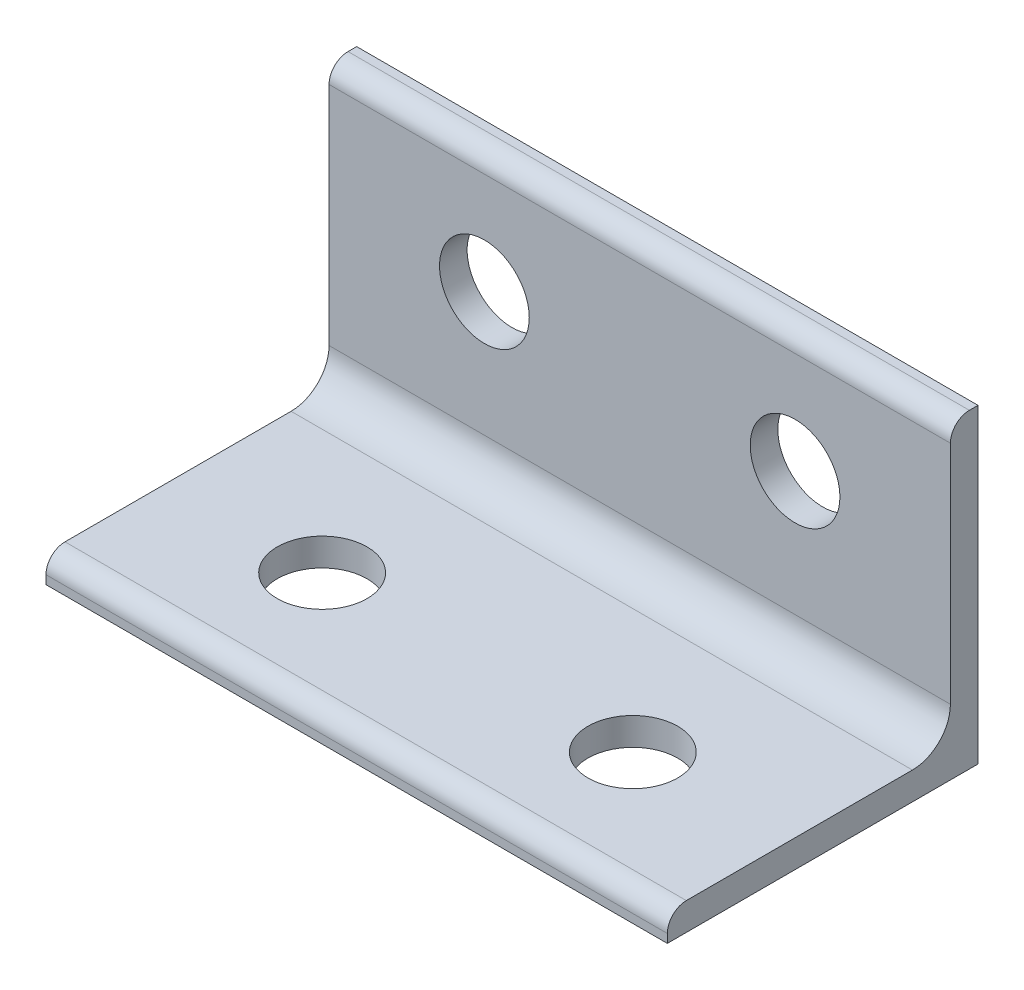
ISO-10303-21;
HEADER;
FILE_DESCRIPTION(('STEP AP214'),'2;1');
FILE_NAME('part.step','',(''),(''),'','','');
FILE_SCHEMA(('AUTOMOTIVE_DESIGN { 1 0 10303 214 1 1 1 1 }'));
ENDSEC;
DATA;
#1=APPLICATION_CONTEXT('core data for automotive mechanical design processes');
#2=APPLICATION_PROTOCOL_DEFINITION('international standard','automotive_design',2000,#1);
#3=PRODUCT_CONTEXT('',#1,'mechanical');
#4=PRODUCT('Part','Part','',(#3));
#5=PRODUCT_RELATED_PRODUCT_CATEGORY('part','',(#4));
#6=PRODUCT_DEFINITION_FORMATION('','',#4);
#7=PRODUCT_DEFINITION_CONTEXT('part definition',#1,'design');
#8=PRODUCT_DEFINITION('design','',#6,#7);
#9=PRODUCT_DEFINITION_SHAPE('','',#8);
#10=(LENGTH_UNIT() NAMED_UNIT(*) SI_UNIT(.MILLI.,.METRE.));
#11=(NAMED_UNIT(*) PLANE_ANGLE_UNIT() SI_UNIT($,.RADIAN.));
#12=(NAMED_UNIT(*) SI_UNIT($,.STERADIAN.) SOLID_ANGLE_UNIT());
#13=UNCERTAINTY_MEASURE_WITH_UNIT(LENGTH_MEASURE(1.E-05),#10,'distance_accuracy_value','');
#14=(GEOMETRIC_REPRESENTATION_CONTEXT(3) GLOBAL_UNCERTAINTY_ASSIGNED_CONTEXT((#13)) GLOBAL_UNIT_ASSIGNED_CONTEXT((#10,
#11,#12)) REPRESENTATION_CONTEXT('',''));
#15=CARTESIAN_POINT('',(0.,0.,0.));
#16=DIRECTION('',(0.,0.,1.));
#17=DIRECTION('',(1.,0.,0.));
#18=AXIS2_PLACEMENT_3D('',#15,#16,#17);
#19=CARTESIAN_POINT('',(180.,0.,0.));
#20=DIRECTION('',(0.,0.,1.));
#21=DIRECTION('',(1.,0.,0.));
#22=AXIS2_PLACEMENT_3D('',#19,#20,#21);
#23=PLANE('',#22);
#24=CARTESIAN_POINT('',(135.,55.,0.));
#25=DIRECTION('',(0.,0.,1.));
#26=DIRECTION('',(1.,0.,0.));
#27=AXIS2_PLACEMENT_3D('',#24,#25,#26);
#28=CIRCLE('',#27,13.);
#29=CARTESIAN_POINT('',(148.,55.,0.));
#30=VERTEX_POINT('',#29);
#31=EDGE_CURVE('E273',#30,#30,#28,.F.);
#32=ORIENTED_EDGE('',*,*,#31,.F.);
#33=EDGE_LOOP('',(#32));
#34=FACE_BOUND('',#33,.T.);
#35=CARTESIAN_POINT('',(45.,55.,0.));
#36=DIRECTION('',(0.,0.,1.));
#37=DIRECTION('',(1.,0.,0.));
#38=AXIS2_PLACEMENT_3D('',#35,#36,#37);
#39=CIRCLE('',#38,13.);
#40=CARTESIAN_POINT('',(58.,55.,0.));
#41=VERTEX_POINT('',#40);
#42=EDGE_CURVE('E218',#41,#41,#39,.F.);
#43=ORIENTED_EDGE('',*,*,#42,.F.);
#44=EDGE_LOOP('',(#43));
#45=FACE_BOUND('',#44,.T.);
#46=DIRECTION('',(0.,1.,0.));
#47=VECTOR('',#46,1.);
#48=CARTESIAN_POINT('',(0.,0.,0.));
#49=LINE('',#48,#47);
#50=CARTESIAN_POINT('',(0.,0.,0.));
#51=VERTEX_POINT('',#50);
#52=CARTESIAN_POINT('',(0.,90.,0.));
#53=VERTEX_POINT('',#52);
#54=EDGE_CURVE('E175',#51,#53,#49,.T.);
#55=ORIENTED_EDGE('',*,*,#54,.T.);
#56=DIRECTION('',(-1.,0.,0.));
#57=VECTOR('',#56,1.);
#58=CARTESIAN_POINT('',(180.,90.,0.));
#59=LINE('',#58,#57);
#60=CARTESIAN_POINT('',(180.,90.,0.));
#61=VERTEX_POINT('',#60);
#62=EDGE_CURVE('E13',#61,#53,#59,.T.);
#63=ORIENTED_EDGE('',*,*,#62,.F.);
#64=DIRECTION('',(0.,1.,0.));
#65=VECTOR('',#64,1.);
#66=CARTESIAN_POINT('',(180.,0.,0.));
#67=LINE('',#66,#65);
#68=CARTESIAN_POINT('',(180.,0.,0.));
#69=VERTEX_POINT('',#68);
#70=EDGE_CURVE('E192',#69,#61,#67,.T.);
#71=ORIENTED_EDGE('',*,*,#70,.F.);
#72=DIRECTION('',(-1.,0.,0.));
#73=VECTOR('',#72,1.);
#74=CARTESIAN_POINT('',(180.,0.,0.));
#75=LINE('',#74,#73);
#76=EDGE_CURVE('E171',#69,#51,#75,.T.);
#77=ORIENTED_EDGE('',*,*,#76,.T.);
#78=EDGE_LOOP('',(#55,#63,#71,#77));
#79=FACE_BOUND('',#78,.T.);
#80=ADVANCED_FACE('F71',(#34,#45,#79),#23,.F.);
#81=CARTESIAN_POINT('',(180.,90.,0.));
#82=DIRECTION('',(0.,-1.,0.));
#83=DIRECTION('',(0.,0.,-1.));
#84=AXIS2_PLACEMENT_3D('',#81,#82,#83);
#85=PLANE('',#84);
#86=DIRECTION('',(0.,0.,1.));
#87=VECTOR('',#86,1.);
#88=CARTESIAN_POINT('',(0.,90.,0.));
#89=LINE('',#88,#87);
#90=CARTESIAN_POINT('',(0.,90.,2.5));
#91=VERTEX_POINT('',#90);
#92=EDGE_CURVE('E178',#53,#91,#89,.T.);
#93=ORIENTED_EDGE('',*,*,#92,.T.);
#94=DIRECTION('',(-1.,0.,0.));
#95=VECTOR('',#94,1.);
#96=CARTESIAN_POINT('',(180.,90.,2.5));
#97=LINE('',#96,#95);
#98=CARTESIAN_POINT('',(180.,90.,2.5));
#99=VERTEX_POINT('',#98);
#100=EDGE_CURVE('E80',#99,#91,#97,.T.);
#101=ORIENTED_EDGE('',*,*,#100,.F.);
#102=DIRECTION('',(0.,0.,1.));
#103=VECTOR('',#102,1.);
#104=CARTESIAN_POINT('',(180.,90.,0.));
#105=LINE('',#104,#103);
#106=EDGE_CURVE('E135',#61,#99,#105,.T.);
#107=ORIENTED_EDGE('',*,*,#106,.F.);
#108=ORIENTED_EDGE('',*,*,#62,.T.);
#109=EDGE_LOOP('',(#93,#101,#107,#108));
#110=FACE_BOUND('',#109,.T.);
#111=ADVANCED_FACE('F262',(#110),#85,.F.);
#112=CARTESIAN_POINT('',(180.,84.5,2.5));
#113=DIRECTION('',(-1.,0.,0.));
#114=DIRECTION('',(0.,0.,1.));
#115=AXIS2_PLACEMENT_3D('',#112,#113,#114);
#116=CYLINDRICAL_SURFACE('',#115,5.5);
#117=CARTESIAN_POINT('',(0.,84.5,2.5));
#118=DIRECTION('',(1.,0.,0.));
#119=DIRECTION('',(0.,0.,-1.));
#120=AXIS2_PLACEMENT_3D('',#117,#118,#119);
#121=CIRCLE('',#120,5.5);
#122=CARTESIAN_POINT('',(0.,84.5,8.00000000000001));
#123=VERTEX_POINT('',#122);
#124=EDGE_CURVE('E181',#91,#123,#121,.T.);
#125=ORIENTED_EDGE('',*,*,#124,.T.);
#126=DIRECTION('',(-1.,0.,0.));
#127=VECTOR('',#126,1.);
#128=CARTESIAN_POINT('',(180.,84.5,8.00000000000001));
#129=LINE('',#128,#127);
#130=CARTESIAN_POINT('',(180.,84.5,8.00000000000001));
#131=VERTEX_POINT('',#130);
#132=EDGE_CURVE('E202',#131,#123,#129,.T.);
#133=ORIENTED_EDGE('',*,*,#132,.F.);
#134=CARTESIAN_POINT('',(180.,84.5,2.5));
#135=DIRECTION('',(1.,0.,0.));
#136=DIRECTION('',(0.,0.,-1.));
#137=AXIS2_PLACEMENT_3D('',#134,#135,#136);
#138=CIRCLE('',#137,5.5);
#139=EDGE_CURVE('E224',#99,#131,#138,.T.);
#140=ORIENTED_EDGE('',*,*,#139,.F.);
#141=ORIENTED_EDGE('',*,*,#100,.T.);
#142=EDGE_LOOP('',(#125,#133,#140,#141));
#143=FACE_BOUND('',#142,.T.);
#144=ADVANCED_FACE('F269',(#143),#116,.T.);
#145=CARTESIAN_POINT('',(180.,84.5,8.00000000000001));
#146=DIRECTION('',(0.,0.,-1.));
#147=DIRECTION('',(0.,1.,0.));
#148=AXIS2_PLACEMENT_3D('',#145,#146,#147);
#149=PLANE('',#148);
#150=CARTESIAN_POINT('',(135.,55.,7.99999999999997));
#151=DIRECTION('',(0.,0.,1.));
#152=DIRECTION('',(1.,0.,0.));
#153=AXIS2_PLACEMENT_3D('',#150,#151,#152);
#154=CIRCLE('',#153,13.);
#155=CARTESIAN_POINT('',(148.,55.,7.99999999999997));
#156=VERTEX_POINT('',#155);
#157=EDGE_CURVE('E281',#156,#156,#154,.T.);
#158=ORIENTED_EDGE('',*,*,#157,.F.);
#159=EDGE_LOOP('',(#158));
#160=FACE_BOUND('',#159,.T.);
#161=CARTESIAN_POINT('',(45.,55.,7.99999999999997));
#162=DIRECTION('',(0.,0.,1.));
#163=DIRECTION('',(1.,0.,0.));
#164=AXIS2_PLACEMENT_3D('',#161,#162,#163);
#165=CIRCLE('',#164,13.);
#166=CARTESIAN_POINT('',(58.,55.,7.99999999999997));
#167=VERTEX_POINT('',#166);
#168=EDGE_CURVE('E277',#167,#167,#165,.T.);
#169=ORIENTED_EDGE('',*,*,#168,.F.);
#170=EDGE_LOOP('',(#169));
#171=FACE_BOUND('',#170,.T.);
#172=DIRECTION('',(0.,-1.,0.));
#173=VECTOR('',#172,1.);
#174=CARTESIAN_POINT('',(0.,84.5,8.00000000000001));
#175=LINE('',#174,#173);
#176=CARTESIAN_POINT('',(0.,19.,7.99999999999998));
#177=VERTEX_POINT('',#176);
#178=EDGE_CURVE('E183',#123,#177,#175,.T.);
#179=ORIENTED_EDGE('',*,*,#178,.T.);
#180=DIRECTION('',(-1.,0.,0.));
#181=VECTOR('',#180,1.);
#182=CARTESIAN_POINT('',(180.,19.,7.99999999999998));
#183=LINE('',#182,#181);
#184=CARTESIAN_POINT('',(180.,19.,7.99999999999998));
#185=VERTEX_POINT('',#184);
#186=EDGE_CURVE('E199',#185,#177,#183,.T.);
#187=ORIENTED_EDGE('',*,*,#186,.F.);
#188=DIRECTION('',(0.,-1.,0.));
#189=VECTOR('',#188,1.);
#190=CARTESIAN_POINT('',(180.,84.5,8.00000000000001));
#191=LINE('',#190,#189);
#192=EDGE_CURVE('E226',#131,#185,#191,.T.);
#193=ORIENTED_EDGE('',*,*,#192,.F.);
#194=ORIENTED_EDGE('',*,*,#132,.T.);
#195=EDGE_LOOP('',(#179,#187,#193,#194));
#196=FACE_BOUND('',#195,.T.);
#197=ADVANCED_FACE('F290',(#160,#171,#196),#149,.F.);
#198=CARTESIAN_POINT('',(180.,19.,19.));
#199=DIRECTION('',(-1.,0.,0.));
#200=DIRECTION('',(0.,0.,1.));
#201=AXIS2_PLACEMENT_3D('',#198,#199,#200);
#202=CYLINDRICAL_SURFACE('',#201,11.);
#203=CARTESIAN_POINT('',(0.,19.,19.));
#204=DIRECTION('',(-1.,0.,0.));
#205=DIRECTION('',(0.,0.,1.));
#206=AXIS2_PLACEMENT_3D('',#203,#204,#205);
#207=CIRCLE('',#206,11.);
#208=CARTESIAN_POINT('',(0.,7.99999999999999,19.));
#209=VERTEX_POINT('',#208);
#210=EDGE_CURVE('E185',#177,#209,#207,.T.);
#211=ORIENTED_EDGE('',*,*,#210,.T.);
#212=DIRECTION('',(-1.,0.,0.));
#213=VECTOR('',#212,1.);
#214=CARTESIAN_POINT('',(180.,7.99999999999999,19.));
#215=LINE('',#214,#213);
#216=CARTESIAN_POINT('',(180.,7.99999999999999,19.));
#217=VERTEX_POINT('',#216);
#218=EDGE_CURVE('E196',#217,#209,#215,.T.);
#219=ORIENTED_EDGE('',*,*,#218,.F.);
#220=CARTESIAN_POINT('',(180.,19.,19.));
#221=DIRECTION('',(-1.,0.,0.));
#222=DIRECTION('',(0.,0.,1.));
#223=AXIS2_PLACEMENT_3D('',#220,#221,#222);
#224=CIRCLE('',#223,11.);
#225=EDGE_CURVE('E228',#185,#217,#224,.T.);
#226=ORIENTED_EDGE('',*,*,#225,.F.);
#227=ORIENTED_EDGE('',*,*,#186,.T.);
#228=EDGE_LOOP('',(#211,#219,#226,#227));
#229=FACE_BOUND('',#228,.T.);
#230=ADVANCED_FACE('F234',(#229),#202,.F.);
#231=CARTESIAN_POINT('',(180.,7.99999999999999,19.));
#232=DIRECTION('',(0.,-1.,0.));
#233=DIRECTION('',(0.,0.,-1.));
#234=AXIS2_PLACEMENT_3D('',#231,#232,#233);
#235=PLANE('',#234);
#236=CARTESIAN_POINT('',(135.,8.00000000000002,55.));
#237=DIRECTION('',(0.,-1.,0.));
#238=DIRECTION('',(0.,0.,-1.));
#239=AXIS2_PLACEMENT_3D('',#236,#237,#238);
#240=CIRCLE('',#239,13.);
#241=CARTESIAN_POINT('',(135.,8.00000000000002,42.));
#242=VERTEX_POINT('',#241);
#243=EDGE_CURVE('E208',#242,#242,#240,.F.);
#244=ORIENTED_EDGE('',*,*,#243,.F.);
#245=EDGE_LOOP('',(#244));
#246=FACE_BOUND('',#245,.T.);
#247=CARTESIAN_POINT('',(45.,8.00000000000002,55.));
#248=DIRECTION('',(0.,-1.,0.));
#249=DIRECTION('',(0.,0.,-1.));
#250=AXIS2_PLACEMENT_3D('',#247,#248,#249);
#251=CIRCLE('',#250,13.);
#252=CARTESIAN_POINT('',(45.,8.00000000000002,42.));
#253=VERTEX_POINT('',#252);
#254=EDGE_CURVE('E179',#253,#253,#251,.F.);
#255=ORIENTED_EDGE('',*,*,#254,.F.);
#256=EDGE_LOOP('',(#255));
#257=FACE_BOUND('',#256,.T.);
#258=DIRECTION('',(0.,0.,1.));
#259=VECTOR('',#258,1.);
#260=CARTESIAN_POINT('',(0.,7.99999999999999,19.));
#261=LINE('',#260,#259);
#262=CARTESIAN_POINT('',(0.,8.00000000000001,84.5));
#263=VERTEX_POINT('',#262);
#264=EDGE_CURVE('E187',#209,#263,#261,.T.);
#265=ORIENTED_EDGE('',*,*,#264,.T.);
#266=DIRECTION('',(-1.,0.,0.));
#267=VECTOR('',#266,1.);
#268=CARTESIAN_POINT('',(180.,8.00000000000001,84.5));
#269=LINE('',#268,#267);
#270=CARTESIAN_POINT('',(180.,8.00000000000001,84.5));
#271=VERTEX_POINT('',#270);
#272=EDGE_CURVE('E166',#271,#263,#269,.T.);
#273=ORIENTED_EDGE('',*,*,#272,.F.);
#274=DIRECTION('',(0.,0.,1.));
#275=VECTOR('',#274,1.);
#276=CARTESIAN_POINT('',(180.,7.99999999999999,19.));
#277=LINE('',#276,#275);
#278=EDGE_CURVE('E157',#217,#271,#277,.T.);
#279=ORIENTED_EDGE('',*,*,#278,.F.);
#280=ORIENTED_EDGE('',*,*,#218,.T.);
#281=EDGE_LOOP('',(#265,#273,#279,#280));
#282=FACE_BOUND('',#281,.T.);
#283=ADVANCED_FACE('F238',(#246,#257,#282),#235,.F.);
#284=CARTESIAN_POINT('',(180.,2.5,84.5));
#285=DIRECTION('',(-1.,0.,0.));
#286=DIRECTION('',(0.,0.,1.));
#287=AXIS2_PLACEMENT_3D('',#284,#285,#286);
#288=CYLINDRICAL_SURFACE('',#287,5.5);
#289=CARTESIAN_POINT('',(0.,2.5,84.5));
#290=DIRECTION('',(1.,0.,0.));
#291=DIRECTION('',(0.,0.,-1.));
#292=AXIS2_PLACEMENT_3D('',#289,#290,#291);
#293=CIRCLE('',#292,5.5);
#294=CARTESIAN_POINT('',(0.,2.5,90.));
#295=VERTEX_POINT('',#294);
#296=EDGE_CURVE('E165',#263,#295,#293,.T.);
#297=ORIENTED_EDGE('',*,*,#296,.T.);
#298=DIRECTION('',(-1.,0.,0.));
#299=VECTOR('',#298,1.);
#300=CARTESIAN_POINT('',(180.,2.5,90.));
#301=LINE('',#300,#299);
#302=CARTESIAN_POINT('',(180.,2.5,90.));
#303=VERTEX_POINT('',#302);
#304=EDGE_CURVE('E162',#303,#295,#301,.T.);
#305=ORIENTED_EDGE('',*,*,#304,.F.);
#306=CARTESIAN_POINT('',(180.,2.5,84.5));
#307=DIRECTION('',(1.,0.,0.));
#308=DIRECTION('',(0.,0.,-1.));
#309=AXIS2_PLACEMENT_3D('',#306,#307,#308);
#310=CIRCLE('',#309,5.5);
#311=EDGE_CURVE('E151',#271,#303,#310,.T.);
#312=ORIENTED_EDGE('',*,*,#311,.F.);
#313=ORIENTED_EDGE('',*,*,#272,.T.);
#314=EDGE_LOOP('',(#297,#305,#312,#313));
#315=FACE_BOUND('',#314,.T.);
#316=ADVANCED_FACE('F163',(#315),#288,.T.);
#317=CARTESIAN_POINT('',(180.,2.5,90.));
#318=DIRECTION('',(0.,0.,-1.));
#319=DIRECTION('',(0.,1.,0.));
#320=AXIS2_PLACEMENT_3D('',#317,#318,#319);
#321=PLANE('',#320);
#322=DIRECTION('',(0.,-1.,0.));
#323=VECTOR('',#322,1.);
#324=CARTESIAN_POINT('',(0.,2.5,90.));
#325=LINE('',#324,#323);
#326=CARTESIAN_POINT('',(0.,0.,90.));
#327=VERTEX_POINT('',#326);
#328=EDGE_CURVE('E121',#295,#327,#325,.T.);
#329=ORIENTED_EDGE('',*,*,#328,.T.);
#330=DIRECTION('',(-1.,0.,0.));
#331=VECTOR('',#330,1.);
#332=CARTESIAN_POINT('',(180.,0.,90.));
#333=LINE('',#332,#331);
#334=CARTESIAN_POINT('',(180.,0.,90.));
#335=VERTEX_POINT('',#334);
#336=EDGE_CURVE('E167',#335,#327,#333,.T.);
#337=ORIENTED_EDGE('',*,*,#336,.F.);
#338=DIRECTION('',(0.,-1.,0.));
#339=VECTOR('',#338,1.);
#340=CARTESIAN_POINT('',(180.,2.5,90.));
#341=LINE('',#340,#339);
#342=EDGE_CURVE('E155',#303,#335,#341,.T.);
#343=ORIENTED_EDGE('',*,*,#342,.F.);
#344=ORIENTED_EDGE('',*,*,#304,.T.);
#345=EDGE_LOOP('',(#329,#337,#343,#344));
#346=FACE_BOUND('',#345,.T.);
#347=ADVANCED_FACE('F169',(#346),#321,.F.);
#348=CARTESIAN_POINT('',(180.,0.,90.));
#349=DIRECTION('',(0.,1.,0.));
#350=DIRECTION('',(0.,0.,1.));
#351=AXIS2_PLACEMENT_3D('',#348,#349,#350);
#352=PLANE('',#351);
#353=CARTESIAN_POINT('',(135.,0.,55.));
#354=DIRECTION('',(0.,1.,0.));
#355=DIRECTION('',(0.,0.,1.));
#356=AXIS2_PLACEMENT_3D('',#353,#354,#355);
#357=CIRCLE('',#356,13.);
#358=CARTESIAN_POINT('',(135.,0.,42.));
#359=VERTEX_POINT('',#358);
#360=EDGE_CURVE('E74',#359,#359,#357,.F.);
#361=ORIENTED_EDGE('',*,*,#360,.F.);
#362=EDGE_LOOP('',(#361));
#363=FACE_BOUND('',#362,.T.);
#364=CARTESIAN_POINT('',(45.,0.,55.));
#365=DIRECTION('',(0.,1.,0.));
#366=DIRECTION('',(0.,0.,1.));
#367=AXIS2_PLACEMENT_3D('',#364,#365,#366);
#368=CIRCLE('',#367,13.);
#369=CARTESIAN_POINT('',(45.,0.,42.));
#370=VERTEX_POINT('',#369);
#371=EDGE_CURVE('E206',#370,#370,#368,.F.);
#372=ORIENTED_EDGE('',*,*,#371,.F.);
#373=EDGE_LOOP('',(#372));
#374=FACE_BOUND('',#373,.T.);
#375=DIRECTION('',(0.,0.,-1.));
#376=VECTOR('',#375,1.);
#377=CARTESIAN_POINT('',(0.,0.,90.));
#378=LINE('',#377,#376);
#379=EDGE_CURVE('E127',#327,#51,#378,.T.);
#380=ORIENTED_EDGE('',*,*,#379,.T.);
#381=ORIENTED_EDGE('',*,*,#76,.F.);
#382=DIRECTION('',(0.,0.,-1.));
#383=VECTOR('',#382,1.);
#384=CARTESIAN_POINT('',(180.,0.,90.));
#385=LINE('',#384,#383);
#386=EDGE_CURVE('E89',#335,#69,#385,.T.);
#387=ORIENTED_EDGE('',*,*,#386,.F.);
#388=ORIENTED_EDGE('',*,*,#336,.T.);
#389=EDGE_LOOP('',(#380,#381,#387,#388));
#390=FACE_BOUND('',#389,.T.);
#391=ADVANCED_FACE('F246',(#363,#374,#390),#352,.F.);
#392=CARTESIAN_POINT('',(180.,84.5,2.5));
#393=DIRECTION('',(1.,0.,0.));
#394=DIRECTION('',(0.,0.,-1.));
#395=AXIS2_PLACEMENT_3D('',#392,#393,#394);
#396=PLANE('',#395);
#397=ORIENTED_EDGE('',*,*,#70,.T.);
#398=ORIENTED_EDGE('',*,*,#106,.T.);
#399=ORIENTED_EDGE('',*,*,#139,.T.);
#400=ORIENTED_EDGE('',*,*,#192,.T.);
#401=ORIENTED_EDGE('',*,*,#225,.T.);
#402=ORIENTED_EDGE('',*,*,#278,.T.);
#403=ORIENTED_EDGE('',*,*,#311,.T.);
#404=ORIENTED_EDGE('',*,*,#342,.T.);
#405=ORIENTED_EDGE('',*,*,#386,.T.);
#406=EDGE_LOOP('',(#397,#398,#399,#400,#401,#402,#403,#404,#405));
#407=FACE_BOUND('',#406,.T.);
#408=ADVANCED_FACE('F153',(#407),#396,.T.);
#409=CARTESIAN_POINT('',(0.,84.5,2.5));
#410=DIRECTION('',(1.,0.,0.));
#411=DIRECTION('',(0.,0.,-1.));
#412=AXIS2_PLACEMENT_3D('',#409,#410,#411);
#413=PLANE('',#412);
#414=ORIENTED_EDGE('',*,*,#54,.F.);
#415=ORIENTED_EDGE('',*,*,#379,.F.);
#416=ORIENTED_EDGE('',*,*,#328,.F.);
#417=ORIENTED_EDGE('',*,*,#296,.F.);
#418=ORIENTED_EDGE('',*,*,#264,.F.);
#419=ORIENTED_EDGE('',*,*,#210,.F.);
#420=ORIENTED_EDGE('',*,*,#178,.F.);
#421=ORIENTED_EDGE('',*,*,#124,.F.);
#422=ORIENTED_EDGE('',*,*,#92,.F.);
#423=EDGE_LOOP('',(#414,#415,#416,#417,#418,#419,#420,#421,#422));
#424=FACE_BOUND('',#423,.T.);
#425=ADVANCED_FACE('F241',(#424),#413,.F.);
#426=CARTESIAN_POINT('',(45.,90.,55.));
#427=DIRECTION('',(0.,-1.,0.));
#428=DIRECTION('',(0.,0.,-1.));
#429=AXIS2_PLACEMENT_3D('',#426,#427,#428);
#430=CYLINDRICAL_SURFACE('',#429,13.);
#431=CARTESIAN_POINT('',(45.,0.,42.));
#432=CARTESIAN_POINT('',(45.,0.0833333333333472,42.));
#433=CARTESIAN_POINT('',(45.,0.166666666666681,42.));
#434=CARTESIAN_POINT('',(45.,0.333333333333348,42.));
#435=CARTESIAN_POINT('',(45.,0.416666666666681,42.));
#436=CARTESIAN_POINT('',(45.,0.583333333333348,42.));
#437=CARTESIAN_POINT('',(45.,0.666666666666681,42.));
#438=CARTESIAN_POINT('',(45.,0.833333333333348,42.));
#439=CARTESIAN_POINT('',(45.,0.916666666666681,42.));
#440=CARTESIAN_POINT('',(45.,1.08333333333335,42.));
#441=CARTESIAN_POINT('',(45.,1.16666666666668,42.));
#442=CARTESIAN_POINT('',(45.,1.33333333333335,42.));
#443=CARTESIAN_POINT('',(45.,1.41666666666668,42.));
#444=CARTESIAN_POINT('',(45.,1.58333333333335,42.));
#445=CARTESIAN_POINT('',(45.,1.66666666666668,42.));
#446=CARTESIAN_POINT('',(45.,1.83333333333335,42.));
#447=CARTESIAN_POINT('',(45.,1.91666666666668,42.));
#448=CARTESIAN_POINT('',(45.,2.08333333333335,42.));
#449=CARTESIAN_POINT('',(45.,2.16666666666668,42.));
#450=CARTESIAN_POINT('',(45.,2.33333333333335,42.));
#451=CARTESIAN_POINT('',(45.,2.41666666666668,42.));
#452=CARTESIAN_POINT('',(45.,2.58333333333335,42.));
#453=CARTESIAN_POINT('',(45.,2.66666666666668,42.));
#454=CARTESIAN_POINT('',(45.,2.83333333333335,42.));
#455=CARTESIAN_POINT('',(45.,2.91666666666668,42.));
#456=CARTESIAN_POINT('',(45.,3.08333333333335,42.));
#457=CARTESIAN_POINT('',(45.,3.16666666666668,42.));
#458=CARTESIAN_POINT('',(45.,3.33333333333335,42.));
#459=CARTESIAN_POINT('',(45.,3.41666666666668,42.));
#460=CARTESIAN_POINT('',(45.,3.58333333333335,42.));
#461=CARTESIAN_POINT('',(45.,3.66666666666668,42.));
#462=CARTESIAN_POINT('',(45.,3.83333333333335,42.));
#463=CARTESIAN_POINT('',(45.,3.91666666666668,42.));
#464=CARTESIAN_POINT('',(45.,4.08333333333335,42.));
#465=CARTESIAN_POINT('',(45.,4.16666666666668,42.));
#466=CARTESIAN_POINT('',(45.,4.33333333333335,42.));
#467=CARTESIAN_POINT('',(45.,4.41666666666668,42.));
#468=CARTESIAN_POINT('',(45.,4.58333333333335,42.));
#469=CARTESIAN_POINT('',(45.,4.66666666666668,42.));
#470=CARTESIAN_POINT('',(45.,4.83333333333335,42.));
#471=CARTESIAN_POINT('',(45.,4.91666666666668,42.));
#472=CARTESIAN_POINT('',(45.,5.08333333333335,42.));
#473=CARTESIAN_POINT('',(45.,5.16666666666668,42.));
#474=CARTESIAN_POINT('',(45.,5.33333333333335,42.));
#475=CARTESIAN_POINT('',(45.,5.41666666666668,42.));
#476=CARTESIAN_POINT('',(45.,5.58333333333335,42.));
#477=CARTESIAN_POINT('',(45.,5.66666666666669,42.));
#478=CARTESIAN_POINT('',(45.,5.83333333333335,42.));
#479=CARTESIAN_POINT('',(45.,5.91666666666669,42.));
#480=CARTESIAN_POINT('',(45.,6.08333333333335,42.));
#481=CARTESIAN_POINT('',(45.,6.16666666666669,42.));
#482=CARTESIAN_POINT('',(45.,6.33333333333335,42.));
#483=CARTESIAN_POINT('',(45.,6.41666666666669,42.));
#484=CARTESIAN_POINT('',(45.,6.58333333333335,42.));
#485=CARTESIAN_POINT('',(45.,6.66666666666669,42.));
#486=CARTESIAN_POINT('',(45.,6.83333333333335,42.));
#487=CARTESIAN_POINT('',(45.,6.91666666666669,42.));
#488=CARTESIAN_POINT('',(45.,7.08333333333335,42.));
#489=CARTESIAN_POINT('',(45.,7.16666666666669,42.));
#490=CARTESIAN_POINT('',(45.,7.33333333333335,42.));
#491=CARTESIAN_POINT('',(45.,7.41666666666669,42.));
#492=CARTESIAN_POINT('',(45.,7.58333333333335,42.));
#493=CARTESIAN_POINT('',(45.,7.66666666666669,42.));
#494=CARTESIAN_POINT('',(45.,7.83333333333335,42.));
#495=CARTESIAN_POINT('',(45.,7.91666666666669,42.));
#496=CARTESIAN_POINT('',(45.,8.00000000000002,42.));
#497=B_SPLINE_CURVE_WITH_KNOTS('',3,(#431,#432,#433,#434,#435,#436,#437,#438,#439,#440,#441,
#442,#443,#444,#445,#446,#447,#448,#449,#450,#451,#452,#453,#454,#455,#456,#457,#458,#459,#460,
#461,#462,#463,#464,#465,#466,#467,#468,#469,#470,#471,#472,#473,#474,#475,#476,#477,#478,#479,
#480,#481,#482,#483,#484,#485,#486,#487,#488,#489,#490,#491,#492,#493,#494,#495,#496),
.UNSPECIFIED.,.F.,.F.,(4,2,2,2,2,2,2,2,2,2,2,2,2,2,2,2,2,2,2,2,2,2,2,2,2,2,2,2,2,2,2,2,4),(0.,
0.25,0.5,0.750000000000001,1.,1.25,1.5,1.75,2.,2.25,2.5,2.75,3.,3.25,3.5,3.75,4.,4.25,4.5,4.75,
5.,5.25,5.50000000000001,5.75000000000001,6.00000000000001,6.25000000000001,6.50000000000001,
6.75000000000001,7.00000000000001,7.25000000000001,7.50000000000001,7.75000000000001,
8.00000000000001),.UNSPECIFIED.);
#498=EDGE_CURVE('BSEAM330',#370,#253,#497,.T.);
#499=ORIENTED_EDGE('',*,*,#371,.T.);
#500=ORIENTED_EDGE('',*,*,#254,.T.);
#501=ORIENTED_EDGE('',*,*,#498,.T.);
#502=ORIENTED_EDGE('',*,*,#498,.F.);
#503=EDGE_LOOP('',(#499,#501,#500,#502));
#504=FACE_BOUND('',#503,.T.);
#505=ADVANCED_FACE('F330',(#504),#430,.F.);
#506=CARTESIAN_POINT('',(135.,90.,55.));
#507=DIRECTION('',(0.,-1.,0.));
#508=DIRECTION('',(0.,0.,-1.));
#509=AXIS2_PLACEMENT_3D('',#506,#507,#508);
#510=CYLINDRICAL_SURFACE('',#509,13.);
#511=CARTESIAN_POINT('',(135.,0.,42.));
#512=CARTESIAN_POINT('',(135.,0.0833333333333472,42.));
#513=CARTESIAN_POINT('',(135.,0.166666666666681,42.));
#514=CARTESIAN_POINT('',(135.,0.333333333333348,42.));
#515=CARTESIAN_POINT('',(135.,0.416666666666681,42.));
#516=CARTESIAN_POINT('',(135.,0.583333333333348,42.));
#517=CARTESIAN_POINT('',(135.,0.666666666666681,42.));
#518=CARTESIAN_POINT('',(135.,0.833333333333348,42.));
#519=CARTESIAN_POINT('',(135.,0.916666666666681,42.));
#520=CARTESIAN_POINT('',(135.,1.08333333333335,42.));
#521=CARTESIAN_POINT('',(135.,1.16666666666668,42.));
#522=CARTESIAN_POINT('',(135.,1.33333333333335,42.));
#523=CARTESIAN_POINT('',(135.,1.41666666666668,42.));
#524=CARTESIAN_POINT('',(135.,1.58333333333335,42.));
#525=CARTESIAN_POINT('',(135.,1.66666666666668,42.));
#526=CARTESIAN_POINT('',(135.,1.83333333333335,42.));
#527=CARTESIAN_POINT('',(135.,1.91666666666668,42.));
#528=CARTESIAN_POINT('',(135.,2.08333333333335,42.));
#529=CARTESIAN_POINT('',(135.,2.16666666666668,42.));
#530=CARTESIAN_POINT('',(135.,2.33333333333335,42.));
#531=CARTESIAN_POINT('',(135.,2.41666666666668,42.));
#532=CARTESIAN_POINT('',(135.,2.58333333333335,42.));
#533=CARTESIAN_POINT('',(135.,2.66666666666668,42.));
#534=CARTESIAN_POINT('',(135.,2.83333333333335,42.));
#535=CARTESIAN_POINT('',(135.,2.91666666666668,42.));
#536=CARTESIAN_POINT('',(135.,3.08333333333335,42.));
#537=CARTESIAN_POINT('',(135.,3.16666666666668,42.));
#538=CARTESIAN_POINT('',(135.,3.33333333333335,42.));
#539=CARTESIAN_POINT('',(135.,3.41666666666668,42.));
#540=CARTESIAN_POINT('',(135.,3.58333333333335,42.));
#541=CARTESIAN_POINT('',(135.,3.66666666666668,42.));
#542=CARTESIAN_POINT('',(135.,3.83333333333335,42.));
#543=CARTESIAN_POINT('',(135.,3.91666666666668,42.));
#544=CARTESIAN_POINT('',(135.,4.08333333333335,42.));
#545=CARTESIAN_POINT('',(135.,4.16666666666668,42.));
#546=CARTESIAN_POINT('',(135.,4.33333333333335,42.));
#547=CARTESIAN_POINT('',(135.,4.41666666666668,42.));
#548=CARTESIAN_POINT('',(135.,4.58333333333335,42.));
#549=CARTESIAN_POINT('',(135.,4.66666666666668,42.));
#550=CARTESIAN_POINT('',(135.,4.83333333333335,42.));
#551=CARTESIAN_POINT('',(135.,4.91666666666668,42.));
#552=CARTESIAN_POINT('',(135.,5.08333333333335,42.));
#553=CARTESIAN_POINT('',(135.,5.16666666666668,42.));
#554=CARTESIAN_POINT('',(135.,5.33333333333335,42.));
#555=CARTESIAN_POINT('',(135.,5.41666666666668,42.));
#556=CARTESIAN_POINT('',(135.,5.58333333333335,42.));
#557=CARTESIAN_POINT('',(135.,5.66666666666669,42.));
#558=CARTESIAN_POINT('',(135.,5.83333333333335,42.));
#559=CARTESIAN_POINT('',(135.,5.91666666666669,42.));
#560=CARTESIAN_POINT('',(135.,6.08333333333335,42.));
#561=CARTESIAN_POINT('',(135.,6.16666666666669,42.));
#562=CARTESIAN_POINT('',(135.,6.33333333333335,42.));
#563=CARTESIAN_POINT('',(135.,6.41666666666669,42.));
#564=CARTESIAN_POINT('',(135.,6.58333333333335,42.));
#565=CARTESIAN_POINT('',(135.,6.66666666666669,42.));
#566=CARTESIAN_POINT('',(135.,6.83333333333335,42.));
#567=CARTESIAN_POINT('',(135.,6.91666666666669,42.));
#568=CARTESIAN_POINT('',(135.,7.08333333333335,42.));
#569=CARTESIAN_POINT('',(135.,7.16666666666669,42.));
#570=CARTESIAN_POINT('',(135.,7.33333333333335,42.));
#571=CARTESIAN_POINT('',(135.,7.41666666666669,42.));
#572=CARTESIAN_POINT('',(135.,7.58333333333335,42.));
#573=CARTESIAN_POINT('',(135.,7.66666666666669,42.));
#574=CARTESIAN_POINT('',(135.,7.83333333333335,42.));
#575=CARTESIAN_POINT('',(135.,7.91666666666669,42.));
#576=CARTESIAN_POINT('',(135.,8.00000000000002,42.));
#577=B_SPLINE_CURVE_WITH_KNOTS('',3,(#511,#512,#513,#514,#515,#516,#517,#518,#519,#520,#521,
#522,#523,#524,#525,#526,#527,#528,#529,#530,#531,#532,#533,#534,#535,#536,#537,#538,#539,#540,
#541,#542,#543,#544,#545,#546,#547,#548,#549,#550,#551,#552,#553,#554,#555,#556,#557,#558,#559,
#560,#561,#562,#563,#564,#565,#566,#567,#568,#569,#570,#571,#572,#573,#574,#575,#576),
.UNSPECIFIED.,.F.,.F.,(4,2,2,2,2,2,2,2,2,2,2,2,2,2,2,2,2,2,2,2,2,2,2,2,2,2,2,2,2,2,2,2,4),(0.,
0.25,0.5,0.750000000000001,1.,1.25,1.5,1.75,2.,2.25,2.5,2.75,3.,3.25,3.5,3.75,4.,4.25,4.5,4.75,
5.,5.25,5.50000000000001,5.75000000000001,6.00000000000001,6.25000000000001,6.50000000000001,
6.75000000000001,7.00000000000001,7.25000000000001,7.50000000000001,7.75000000000001,
8.00000000000001),.UNSPECIFIED.);
#578=EDGE_CURVE('BSEAM336',#359,#242,#577,.T.);
#579=ORIENTED_EDGE('',*,*,#360,.T.);
#580=ORIENTED_EDGE('',*,*,#243,.T.);
#581=ORIENTED_EDGE('',*,*,#578,.T.);
#582=ORIENTED_EDGE('',*,*,#578,.F.);
#583=EDGE_LOOP('',(#579,#581,#580,#582));
#584=FACE_BOUND('',#583,.T.);
#585=ADVANCED_FACE('F336',(#584),#510,.F.);
#586=CARTESIAN_POINT('',(45.,55.,-0.000999999999999265));
#587=DIRECTION('',(0.,0.,1.));
#588=DIRECTION('',(1.,0.,0.));
#589=AXIS2_PLACEMENT_3D('',#586,#587,#588);
#590=CYLINDRICAL_SURFACE('',#589,13.);
#591=ORIENTED_EDGE('',*,*,#168,.T.);
#592=EDGE_LOOP('',(#591));
#593=FACE_BOUND('',#592,.T.);
#594=ORIENTED_EDGE('',*,*,#42,.T.);
#595=EDGE_LOOP('',(#594));
#596=FACE_BOUND('',#595,.T.);
#597=ADVANCED_FACE('F391',(#593,#596),#590,.F.);
#598=CARTESIAN_POINT('',(135.,55.,-0.000999999999999265));
#599=DIRECTION('',(0.,0.,1.));
#600=DIRECTION('',(1.,0.,0.));
#601=AXIS2_PLACEMENT_3D('',#598,#599,#600);
#602=CYLINDRICAL_SURFACE('',#601,13.);
#603=ORIENTED_EDGE('',*,*,#157,.T.);
#604=EDGE_LOOP('',(#603));
#605=FACE_BOUND('',#604,.T.);
#606=ORIENTED_EDGE('',*,*,#31,.T.);
#607=EDGE_LOOP('',(#606));
#608=FACE_BOUND('',#607,.T.);
#609=ADVANCED_FACE('F287',(#605,#608),#602,.F.);
#610=CLOSED_SHELL('',(#80,#111,#144,#197,#230,#283,#316,#347,#391,#408,#425,#505,#585,#597,#609));
#611=MANIFOLD_SOLID_BREP('B2',#610);
#612=ADVANCED_BREP_SHAPE_REPRESENTATION('',(#18,#611),#14);
#613=SHAPE_DEFINITION_REPRESENTATION(#9,#612);
ENDSEC;
END-ISO-10303-21;
